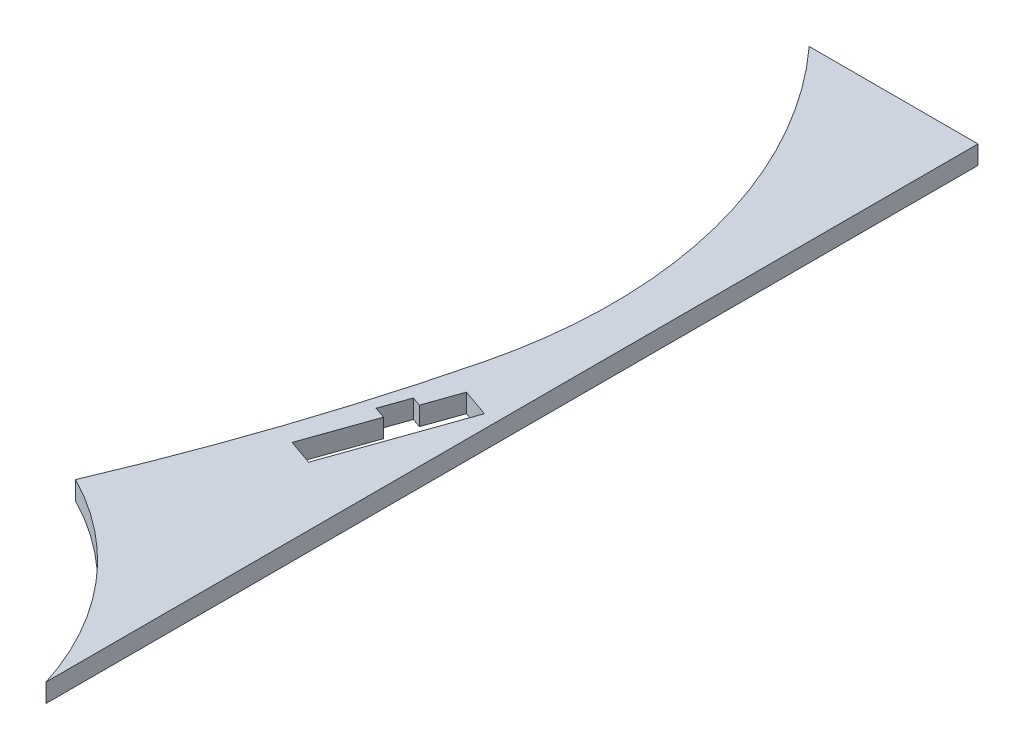
ISO-10303-21;
HEADER;
FILE_DESCRIPTION(('STEP AP214'),'2;1');
FILE_NAME('part.step','',(''),(''),'','','');
FILE_SCHEMA(('AUTOMOTIVE_DESIGN { 1 0 10303 214 1 1 1 1 }'));
ENDSEC;
DATA;
#1=APPLICATION_CONTEXT('core data for automotive mechanical design processes');
#2=APPLICATION_PROTOCOL_DEFINITION('international standard','automotive_design',2000,#1);
#3=PRODUCT_CONTEXT('',#1,'mechanical');
#4=PRODUCT('Part','Part','',(#3));
#5=PRODUCT_RELATED_PRODUCT_CATEGORY('part','',(#4));
#6=PRODUCT_DEFINITION_FORMATION('','',#4);
#7=PRODUCT_DEFINITION_CONTEXT('part definition',#1,'design');
#8=PRODUCT_DEFINITION('design','',#6,#7);
#9=PRODUCT_DEFINITION_SHAPE('','',#8);
#10=(LENGTH_UNIT() NAMED_UNIT(*) SI_UNIT(.MILLI.,.METRE.));
#11=(NAMED_UNIT(*) PLANE_ANGLE_UNIT() SI_UNIT($,.RADIAN.));
#12=(NAMED_UNIT(*) SI_UNIT($,.STERADIAN.) SOLID_ANGLE_UNIT());
#13=UNCERTAINTY_MEASURE_WITH_UNIT(LENGTH_MEASURE(1.E-05),#10,'distance_accuracy_value','');
#14=(GEOMETRIC_REPRESENTATION_CONTEXT(3) GLOBAL_UNCERTAINTY_ASSIGNED_CONTEXT((#13)) GLOBAL_UNIT_ASSIGNED_CONTEXT((#10,
#11,#12)) REPRESENTATION_CONTEXT('',''));
#15=CARTESIAN_POINT('',(0.,0.,0.));
#16=DIRECTION('',(0.,0.,1.));
#17=DIRECTION('',(1.,0.,0.));
#18=AXIS2_PLACEMENT_3D('',#15,#16,#17);
#19=CARTESIAN_POINT('',(-123.824999999997,6.35,32.9878065635989));
#20=DIRECTION('',(0.,-1.,0.));
#21=DIRECTION('',(0.,0.,-1.));
#22=AXIS2_PLACEMENT_3D('',#19,#20,#21);
#23=CYLINDRICAL_SURFACE('',#22,109.845327651549);
#24=CARTESIAN_POINT('',(-123.824999999997,0.,32.9878065635989));
#25=DIRECTION('',(0.,-1.,0.));
#26=DIRECTION('',(0.,0.,-1.));
#27=AXIS2_PLACEMENT_3D('',#24,#25,#26);
#28=CIRCLE('',#27,109.845327651549);
#29=CARTESIAN_POINT('',(-73.7224108953443,0.,-64.7655901645279));
#30=VERTEX_POINT('',#29);
#31=CARTESIAN_POINT('',(-19.0500000000028,0.,0.));
#32=VERTEX_POINT('',#31);
#33=EDGE_CURVE('E184',#30,#32,#28,.T.);
#34=ORIENTED_EDGE('',*,*,#33,.T.);
#35=DIRECTION('',(0.,-1.,0.));
#36=VECTOR('',#35,1.);
#37=CARTESIAN_POINT('',(-19.0500000000028,6.35,0.));
#38=LINE('',#37,#36);
#39=CARTESIAN_POINT('',(-19.0500000000028,6.35,0.));
#40=VERTEX_POINT('',#39);
#41=EDGE_CURVE('E11',#40,#32,#38,.T.);
#42=ORIENTED_EDGE('',*,*,#41,.F.);
#43=CARTESIAN_POINT('',(-123.824999999997,6.35,32.9878065635989));
#44=DIRECTION('',(0.,-1.,0.));
#45=DIRECTION('',(0.,0.,-1.));
#46=AXIS2_PLACEMENT_3D('',#43,#44,#45);
#47=CIRCLE('',#46,109.845327651549);
#48=CARTESIAN_POINT('',(-73.7224108953443,6.35,-64.7655901645279));
#49=VERTEX_POINT('',#48);
#50=EDGE_CURVE('E196',#49,#40,#47,.T.);
#51=ORIENTED_EDGE('',*,*,#50,.F.);
#52=DIRECTION('',(0.,-1.,0.));
#53=VECTOR('',#52,1.);
#54=CARTESIAN_POINT('',(-73.7224108953443,6.35,-64.7655901645279));
#55=LINE('',#54,#53);
#56=EDGE_CURVE('E208',#49,#30,#55,.T.);
#57=ORIENTED_EDGE('',*,*,#56,.T.);
#58=EDGE_LOOP('',(#34,#42,#51,#57));
#59=FACE_BOUND('',#58,.T.);
#60=ADVANCED_FACE('F33',(#59),#23,.F.);
#61=CARTESIAN_POINT('',(-19.0500000000028,6.35,-169.388632852006));
#62=DIRECTION('',(-1.,0.,0.));
#63=DIRECTION('',(0.,0.,1.));
#64=AXIS2_PLACEMENT_3D('',#61,#62,#63);
#65=PLANE('',#64);
#66=DIRECTION('',(0.,0.,-1.));
#67=VECTOR('',#66,1.);
#68=CARTESIAN_POINT('',(-19.0500000000028,0.,-169.388632852006));
#69=LINE('',#68,#67);
#70=CARTESIAN_POINT('',(-19.0500000000028,0.,-317.5));
#71=VERTEX_POINT('',#70);
#72=EDGE_CURVE('E211',#32,#71,#69,.T.);
#73=ORIENTED_EDGE('',*,*,#72,.T.);
#74=DIRECTION('',(0.,-1.,0.));
#75=VECTOR('',#74,1.);
#76=CARTESIAN_POINT('',(-19.0500000000028,6.35,-317.5));
#77=LINE('',#76,#75);
#78=CARTESIAN_POINT('',(-19.0500000000028,6.35,-317.5));
#79=VERTEX_POINT('',#78);
#80=EDGE_CURVE('E40',#79,#71,#77,.T.);
#81=ORIENTED_EDGE('',*,*,#80,.F.);
#82=DIRECTION('',(0.,0.,-1.));
#83=VECTOR('',#82,1.);
#84=CARTESIAN_POINT('',(-19.0500000000028,6.35,-169.388632852006));
#85=LINE('',#84,#83);
#86=EDGE_CURVE('E199',#40,#79,#85,.T.);
#87=ORIENTED_EDGE('',*,*,#86,.F.);
#88=ORIENTED_EDGE('',*,*,#41,.T.);
#89=EDGE_LOOP('',(#73,#81,#87,#88));
#90=FACE_BOUND('',#89,.T.);
#91=ADVANCED_FACE('F248',(#90),#65,.F.);
#92=CARTESIAN_POINT('',(-19.0500000000028,6.35,-317.5));
#93=DIRECTION('',(0.,0.,1.));
#94=DIRECTION('',(1.,0.,0.));
#95=AXIS2_PLACEMENT_3D('',#92,#93,#94);
#96=PLANE('',#95);
#97=DIRECTION('',(-1.,0.,0.));
#98=VECTOR('',#97,1.);
#99=CARTESIAN_POINT('',(-19.0500000000028,0.,-317.5));
#100=LINE('',#99,#98);
#101=CARTESIAN_POINT('',(-76.5547912673362,0.,-317.499999999998));
#102=VERTEX_POINT('',#101);
#103=EDGE_CURVE('E213',#71,#102,#100,.T.);
#104=ORIENTED_EDGE('',*,*,#103,.T.);
#105=DIRECTION('',(0.,-1.,0.));
#106=VECTOR('',#105,1.);
#107=CARTESIAN_POINT('',(-76.5547912673362,6.35,-317.499999999998));
#108=LINE('',#107,#106);
#109=CARTESIAN_POINT('',(-76.5547912673362,6.35,-317.499999999998));
#110=VERTEX_POINT('',#109);
#111=EDGE_CURVE('E223',#110,#102,#108,.T.);
#112=ORIENTED_EDGE('',*,*,#111,.F.);
#113=DIRECTION('',(-1.,0.,0.));
#114=VECTOR('',#113,1.);
#115=CARTESIAN_POINT('',(-19.0500000000028,6.35,-317.5));
#116=LINE('',#115,#114);
#117=EDGE_CURVE('E202',#79,#110,#116,.T.);
#118=ORIENTED_EDGE('',*,*,#117,.F.);
#119=ORIENTED_EDGE('',*,*,#80,.T.);
#120=EDGE_LOOP('',(#104,#112,#118,#119));
#121=FACE_BOUND('',#120,.T.);
#122=ADVANCED_FACE('F230',(#121),#96,.F.);
#123=CARTESIAN_POINT('',(-196.510004657738,6.35,-208.136195969553));
#124=DIRECTION('',(0.,-1.,0.));
#125=DIRECTION('',(0.,0.,-1.));
#126=AXIS2_PLACEMENT_3D('',#123,#124,#125);
#127=CYLINDRICAL_SURFACE('',#126,162.325890884808);
#128=CARTESIAN_POINT('',(-196.510004657738,0.,-208.136195969553));
#129=DIRECTION('',(0.,-1.,0.));
#130=DIRECTION('',(0.,0.,1.));
#131=AXIS2_PLACEMENT_3D('',#128,#129,#130);
#132=CIRCLE('',#131,162.325890884808);
#133=CARTESIAN_POINT('',(-38.8765018609086,0.,-169.388632852004));
#134=VERTEX_POINT('',#133);
#135=EDGE_CURVE('E215',#102,#134,#132,.T.);
#136=ORIENTED_EDGE('',*,*,#135,.T.);
#137=DIRECTION('',(0.,-1.,0.));
#138=VECTOR('',#137,1.);
#139=CARTESIAN_POINT('',(-38.8765018609086,6.35,-169.388632852004));
#140=LINE('',#139,#138);
#141=CARTESIAN_POINT('',(-38.8765018609086,6.35,-169.388632852004));
#142=VERTEX_POINT('',#141);
#143=EDGE_CURVE('E220',#142,#134,#140,.T.);
#144=ORIENTED_EDGE('',*,*,#143,.F.);
#145=CARTESIAN_POINT('',(-196.510004657738,6.35,-208.136195969553));
#146=DIRECTION('',(0.,-1.,0.));
#147=DIRECTION('',(0.,0.,1.));
#148=AXIS2_PLACEMENT_3D('',#145,#146,#147);
#149=CIRCLE('',#148,162.325890884808);
#150=EDGE_CURVE('E204',#110,#142,#149,.T.);
#151=ORIENTED_EDGE('',*,*,#150,.F.);
#152=ORIENTED_EDGE('',*,*,#111,.T.);
#153=EDGE_LOOP('',(#136,#144,#151,#152));
#154=FACE_BOUND('',#153,.T.);
#155=ADVANCED_FACE('F238',(#154),#127,.F.);
#156=CARTESIAN_POINT('',(-704.917093121844,6.35,-333.106683842696));
#157=DIRECTION('',(0.,-1.,0.));
#158=DIRECTION('',(0.,0.,-1.));
#159=AXIS2_PLACEMENT_3D('',#156,#157,#158);
#160=CYLINDRICAL_SURFACE('',#159,685.867093121843);
#161=CARTESIAN_POINT('',(-704.917093121844,0.,-333.106683842696));
#162=DIRECTION('',(0.,-1.,0.));
#163=DIRECTION('',(0.,0.,1.));
#164=AXIS2_PLACEMENT_3D('',#161,#162,#163);
#165=CIRCLE('',#164,685.867093121843);
#166=EDGE_CURVE('E200',#134,#30,#165,.T.);
#167=ORIENTED_EDGE('',*,*,#166,.T.);
#168=ORIENTED_EDGE('',*,*,#56,.F.);
#169=CARTESIAN_POINT('',(-704.917093121844,6.35,-333.106683842696));
#170=DIRECTION('',(0.,-1.,0.));
#171=DIRECTION('',(0.,0.,1.));
#172=AXIS2_PLACEMENT_3D('',#169,#170,#171);
#173=CIRCLE('',#172,685.867093121843);
#174=EDGE_CURVE('E206',#142,#49,#173,.T.);
#175=ORIENTED_EDGE('',*,*,#174,.F.);
#176=ORIENTED_EDGE('',*,*,#143,.T.);
#177=EDGE_LOOP('',(#167,#168,#175,#176));
#178=FACE_BOUND('',#177,.T.);
#179=ADVANCED_FACE('F242',(#178),#160,.F.);
#180=CARTESIAN_POINT('',(-123.824999999997,6.35,32.9878065635989));
#181=DIRECTION('',(0.,-1.,0.));
#182=DIRECTION('',(0.,0.,-1.));
#183=AXIS2_PLACEMENT_3D('',#180,#181,#182);
#184=PLANE('',#183);
#185=DIRECTION('',(-0.332782108184797,0.,0.943003747856859));
#186=VECTOR('',#185,1.);
#187=CARTESIAN_POINT('',(-40.2708944301103,6.35,-146.382292029944));
#188=LINE('',#187,#186);
#189=CARTESIAN_POINT('',(-40.2708944301103,6.35,-146.382292029944));
#190=VERTEX_POINT('',#189);
#191=CARTESIAN_POINT('',(-43.5885656576584,6.35,-136.981016165685));
#192=VERTEX_POINT('',#191);
#193=EDGE_CURVE('E166',#190,#192,#188,.T.);
#194=ORIENTED_EDGE('',*,*,#193,.F.);
#195=DIRECTION('',(-0.943003747856859,0.,-0.332782108184795));
#196=VECTOR('',#195,1.);
#197=CARTESIAN_POINT('',(-37.1331437594913,6.35,-145.27499284317));
#198=LINE('',#197,#196);
#199=CARTESIAN_POINT('',(-37.1331437594913,6.35,-145.27499284317));
#200=VERTEX_POINT('',#199);
#201=EDGE_CURVE('E47',#200,#190,#198,.T.);
#202=ORIENTED_EDGE('',*,*,#201,.F.);
#203=DIRECTION('',(-0.332782108184796,0.,0.943003747856859));
#204=VECTOR('',#203,1.);
#205=CARTESIAN_POINT('',(-32.9448479805099,6.35,-157.143355112572));
#206=LINE('',#205,#204);
#207=CARTESIAN_POINT('',(-32.9448479805099,6.35,-157.143355112572));
#208=VERTEX_POINT('',#207);
#209=EDGE_CURVE('E146',#208,#200,#206,.T.);
#210=ORIENTED_EDGE('',*,*,#209,.F.);
#211=DIRECTION('',(-0.943003747856859,0.,-0.332782108184796));
#212=VECTOR('',#211,1.);
#213=CARTESIAN_POINT('',(-23.5435721162512,6.35,-153.825683885023));
#214=LINE('',#213,#212);
#215=CARTESIAN_POINT('',(-23.5435721162512,6.35,-153.825683885023));
#216=VERTEX_POINT('',#215);
#217=EDGE_CURVE('E149',#216,#208,#214,.T.);
#218=ORIENTED_EDGE('',*,*,#217,.F.);
#219=DIRECTION('',(0.332782108184796,0.,-0.943003747856859));
#220=VECTOR('',#219,1.);
#221=CARTESIAN_POINT('',(-39.164098048759,6.35,-109.561842363621));
#222=LINE('',#221,#220);
#223=CARTESIAN_POINT('',(-39.164098048759,6.35,-109.561842363621));
#224=VERTEX_POINT('',#223);
#225=EDGE_CURVE('E177',#224,#216,#222,.T.);
#226=ORIENTED_EDGE('',*,*,#225,.F.);
#227=DIRECTION('',(0.943003747856859,0.,0.332782108184796));
#228=VECTOR('',#227,1.);
#229=CARTESIAN_POINT('',(-47.8108766143577,6.35,-112.61325462641));
#230=LINE('',#229,#228);
#231=CARTESIAN_POINT('',(-47.8108766143577,6.35,-112.61325462641));
#232=VERTEX_POINT('',#231);
#233=EDGE_CURVE('E174',#232,#224,#230,.T.);
#234=ORIENTED_EDGE('',*,*,#233,.F.);
#235=DIRECTION('',(-0.332782108184796,0.,0.943003747856859));
#236=VECTOR('',#235,1.);
#237=CARTESIAN_POINT('',(-39.6963176883795,6.35,-135.607458014153));
#238=LINE('',#237,#236);
#239=CARTESIAN_POINT('',(-39.6963176883795,6.35,-135.607458014153));
#240=VERTEX_POINT('',#239);
#241=EDGE_CURVE('E171',#240,#232,#238,.T.);
#242=ORIENTED_EDGE('',*,*,#241,.F.);
#243=DIRECTION('',(0.943003747856859,0.,0.332782108184797));
#244=VECTOR('',#243,1.);
#245=CARTESIAN_POINT('',(-43.5885656576584,6.35,-136.981016165685));
#246=LINE('',#245,#244);
#247=EDGE_CURVE('E168',#192,#240,#246,.T.);
#248=ORIENTED_EDGE('',*,*,#247,.F.);
#249=EDGE_LOOP('',(#194,#202,#210,#218,#226,#234,#242,#248));
#250=FACE_BOUND('',#249,.T.);
#251=ORIENTED_EDGE('',*,*,#50,.T.);
#252=ORIENTED_EDGE('',*,*,#86,.T.);
#253=ORIENTED_EDGE('',*,*,#117,.T.);
#254=ORIENTED_EDGE('',*,*,#150,.T.);
#255=ORIENTED_EDGE('',*,*,#174,.T.);
#256=EDGE_LOOP('',(#251,#252,#253,#254,#255));
#257=FACE_BOUND('',#256,.T.);
#258=ADVANCED_FACE('F246',(#250,#257),#184,.F.);
#259=CARTESIAN_POINT('',(-123.824999999997,0.,32.9878065635989));
#260=DIRECTION('',(0.,-1.,0.));
#261=DIRECTION('',(0.,0.,-1.));
#262=AXIS2_PLACEMENT_3D('',#259,#260,#261);
#263=PLANE('',#262);
#264=DIRECTION('',(-0.943003747856859,0.,-0.332782108184795));
#265=VECTOR('',#264,1.);
#266=CARTESIAN_POINT('',(-37.1331437594913,0.,-145.27499284317));
#267=LINE('',#266,#265);
#268=CARTESIAN_POINT('',(-37.1331437594913,0.,-145.27499284317));
#269=VERTEX_POINT('',#268);
#270=CARTESIAN_POINT('',(-40.2708944301103,0.,-146.382292029944));
#271=VERTEX_POINT('',#270);
#272=EDGE_CURVE('E129',#269,#271,#267,.T.);
#273=ORIENTED_EDGE('',*,*,#272,.T.);
#274=DIRECTION('',(-0.332782108184797,0.,0.943003747856859));
#275=VECTOR('',#274,1.);
#276=CARTESIAN_POINT('',(-40.2708944301103,0.,-146.382292029944));
#277=LINE('',#276,#275);
#278=CARTESIAN_POINT('',(-43.5885656576584,0.,-136.981016165685));
#279=VERTEX_POINT('',#278);
#280=EDGE_CURVE('E138',#271,#279,#277,.T.);
#281=ORIENTED_EDGE('',*,*,#280,.T.);
#282=DIRECTION('',(0.943003747856859,0.,0.332782108184797));
#283=VECTOR('',#282,1.);
#284=CARTESIAN_POINT('',(-43.5885656576584,0.,-136.981016165685));
#285=LINE('',#284,#283);
#286=CARTESIAN_POINT('',(-39.6963176883795,0.,-135.607458014153));
#287=VERTEX_POINT('',#286);
#288=EDGE_CURVE('E55',#279,#287,#285,.T.);
#289=ORIENTED_EDGE('',*,*,#288,.T.);
#290=DIRECTION('',(-0.332782108184796,0.,0.943003747856859));
#291=VECTOR('',#290,1.);
#292=CARTESIAN_POINT('',(-39.6963176883795,0.,-135.607458014153));
#293=LINE('',#292,#291);
#294=CARTESIAN_POINT('',(-47.8108766143577,0.,-112.61325462641));
#295=VERTEX_POINT('',#294);
#296=EDGE_CURVE('E153',#287,#295,#293,.T.);
#297=ORIENTED_EDGE('',*,*,#296,.T.);
#298=DIRECTION('',(0.943003747856859,0.,0.332782108184796));
#299=VECTOR('',#298,1.);
#300=CARTESIAN_POINT('',(-47.8108766143577,0.,-112.61325462641));
#301=LINE('',#300,#299);
#302=CARTESIAN_POINT('',(-39.164098048759,0.,-109.561842363621));
#303=VERTEX_POINT('',#302);
#304=EDGE_CURVE('E156',#295,#303,#301,.T.);
#305=ORIENTED_EDGE('',*,*,#304,.T.);
#306=DIRECTION('',(0.332782108184796,0.,-0.943003747856859));
#307=VECTOR('',#306,1.);
#308=CARTESIAN_POINT('',(-39.164098048759,0.,-109.561842363621));
#309=LINE('',#308,#307);
#310=CARTESIAN_POINT('',(-23.5435721162512,0.,-153.825683885023));
#311=VERTEX_POINT('',#310);
#312=EDGE_CURVE('E159',#303,#311,#309,.T.);
#313=ORIENTED_EDGE('',*,*,#312,.T.);
#314=DIRECTION('',(-0.943003747856859,0.,-0.332782108184796));
#315=VECTOR('',#314,1.);
#316=CARTESIAN_POINT('',(-23.5435721162512,0.,-153.825683885023));
#317=LINE('',#316,#315);
#318=CARTESIAN_POINT('',(-32.9448479805099,0.,-157.143355112572));
#319=VERTEX_POINT('',#318);
#320=EDGE_CURVE('E162',#311,#319,#317,.T.);
#321=ORIENTED_EDGE('',*,*,#320,.T.);
#322=DIRECTION('',(-0.332782108184796,0.,0.943003747856859));
#323=VECTOR('',#322,1.);
#324=CARTESIAN_POINT('',(-32.9448479805099,0.,-157.143355112572));
#325=LINE('',#324,#323);
#326=EDGE_CURVE('E135',#319,#269,#325,.T.);
#327=ORIENTED_EDGE('',*,*,#326,.T.);
#328=EDGE_LOOP('',(#273,#281,#289,#297,#305,#313,#321,#327));
#329=FACE_BOUND('',#328,.T.);
#330=ORIENTED_EDGE('',*,*,#72,.F.);
#331=ORIENTED_EDGE('',*,*,#33,.F.);
#332=ORIENTED_EDGE('',*,*,#166,.F.);
#333=ORIENTED_EDGE('',*,*,#135,.F.);
#334=ORIENTED_EDGE('',*,*,#103,.F.);
#335=EDGE_LOOP('',(#330,#331,#332,#333,#334));
#336=FACE_BOUND('',#335,.T.);
#337=ADVANCED_FACE('F142',(#329,#336),#263,.T.);
#338=CARTESIAN_POINT('',(-37.1331437594913,0.,-145.27499284317));
#339=DIRECTION('',(0.332782108184795,0.,-0.943003747856859));
#340=DIRECTION('',(-0.943003747856859,0.,-0.332782108184795));
#341=AXIS2_PLACEMENT_3D('',#338,#339,#340);
#342=PLANE('',#341);
#343=ORIENTED_EDGE('',*,*,#201,.T.);
#344=DIRECTION('',(0.,1.,0.));
#345=VECTOR('',#344,1.);
#346=CARTESIAN_POINT('',(-40.2708944301103,0.,-146.382292029944));
#347=LINE('',#346,#345);
#348=EDGE_CURVE('E125',#271,#190,#347,.T.);
#349=ORIENTED_EDGE('',*,*,#348,.F.);
#350=ORIENTED_EDGE('',*,*,#272,.F.);
#351=DIRECTION('',(0.,1.,0.));
#352=VECTOR('',#351,1.);
#353=CARTESIAN_POINT('',(-37.1331437594913,0.,-145.27499284317));
#354=LINE('',#353,#352);
#355=EDGE_CURVE('E182',#269,#200,#354,.T.);
#356=ORIENTED_EDGE('',*,*,#355,.T.);
#357=EDGE_LOOP('',(#343,#349,#350,#356));
#358=FACE_BOUND('',#357,.T.);
#359=ADVANCED_FACE('F127',(#358),#342,.F.);
#360=CARTESIAN_POINT('',(-32.9448479805099,0.,-157.143355112572));
#361=DIRECTION('',(-0.943003747856859,0.,-0.332782108184796));
#362=DIRECTION('',(-0.332782108184796,0.,0.943003747856859));
#363=AXIS2_PLACEMENT_3D('',#360,#361,#362);
#364=PLANE('',#363);
#365=ORIENTED_EDGE('',*,*,#209,.T.);
#366=ORIENTED_EDGE('',*,*,#355,.F.);
#367=ORIENTED_EDGE('',*,*,#326,.F.);
#368=DIRECTION('',(0.,1.,0.));
#369=VECTOR('',#368,1.);
#370=CARTESIAN_POINT('',(-32.9448479805099,0.,-157.143355112572));
#371=LINE('',#370,#369);
#372=EDGE_CURVE('E185',#319,#208,#371,.T.);
#373=ORIENTED_EDGE('',*,*,#372,.T.);
#374=EDGE_LOOP('',(#365,#366,#367,#373));
#375=FACE_BOUND('',#374,.T.);
#376=ADVANCED_FACE('F270',(#375),#364,.F.);
#377=CARTESIAN_POINT('',(-23.5435721162512,0.,-153.825683885023));
#378=DIRECTION('',(0.332782108184796,0.,-0.943003747856859));
#379=DIRECTION('',(-0.943003747856859,0.,-0.332782108184796));
#380=AXIS2_PLACEMENT_3D('',#377,#378,#379);
#381=PLANE('',#380);
#382=ORIENTED_EDGE('',*,*,#217,.T.);
#383=ORIENTED_EDGE('',*,*,#372,.F.);
#384=ORIENTED_EDGE('',*,*,#320,.F.);
#385=DIRECTION('',(0.,1.,0.));
#386=VECTOR('',#385,1.);
#387=CARTESIAN_POINT('',(-23.5435721162512,0.,-153.825683885023));
#388=LINE('',#387,#386);
#389=EDGE_CURVE('E187',#311,#216,#388,.T.);
#390=ORIENTED_EDGE('',*,*,#389,.T.);
#391=EDGE_LOOP('',(#382,#383,#384,#390));
#392=FACE_BOUND('',#391,.T.);
#393=ADVANCED_FACE('F287',(#392),#381,.F.);
#394=CARTESIAN_POINT('',(-39.164098048759,0.,-109.561842363621));
#395=DIRECTION('',(0.943003747856859,0.,0.332782108184796));
#396=DIRECTION('',(0.332782108184796,0.,-0.943003747856859));
#397=AXIS2_PLACEMENT_3D('',#394,#395,#396);
#398=PLANE('',#397);
#399=ORIENTED_EDGE('',*,*,#225,.T.);
#400=ORIENTED_EDGE('',*,*,#389,.F.);
#401=ORIENTED_EDGE('',*,*,#312,.F.);
#402=DIRECTION('',(0.,1.,0.));
#403=VECTOR('',#402,1.);
#404=CARTESIAN_POINT('',(-39.164098048759,0.,-109.561842363621));
#405=LINE('',#404,#403);
#406=EDGE_CURVE('E189',#303,#224,#405,.T.);
#407=ORIENTED_EDGE('',*,*,#406,.T.);
#408=EDGE_LOOP('',(#399,#400,#401,#407));
#409=FACE_BOUND('',#408,.T.);
#410=ADVANCED_FACE('F283',(#409),#398,.F.);
#411=CARTESIAN_POINT('',(-47.8108766143577,0.,-112.61325462641));
#412=DIRECTION('',(-0.332782108184796,0.,0.943003747856859));
#413=DIRECTION('',(0.943003747856859,0.,0.332782108184796));
#414=AXIS2_PLACEMENT_3D('',#411,#412,#413);
#415=PLANE('',#414);
#416=ORIENTED_EDGE('',*,*,#233,.T.);
#417=ORIENTED_EDGE('',*,*,#406,.F.);
#418=ORIENTED_EDGE('',*,*,#304,.F.);
#419=DIRECTION('',(0.,1.,0.));
#420=VECTOR('',#419,1.);
#421=CARTESIAN_POINT('',(-47.8108766143577,0.,-112.61325462641));
#422=LINE('',#421,#420);
#423=EDGE_CURVE('E191',#295,#232,#422,.T.);
#424=ORIENTED_EDGE('',*,*,#423,.T.);
#425=EDGE_LOOP('',(#416,#417,#418,#424));
#426=FACE_BOUND('',#425,.T.);
#427=ADVANCED_FACE('F279',(#426),#415,.F.);
#428=CARTESIAN_POINT('',(-39.6963176883795,0.,-135.607458014153));
#429=DIRECTION('',(-0.943003747856859,0.,-0.332782108184796));
#430=DIRECTION('',(-0.332782108184796,0.,0.943003747856859));
#431=AXIS2_PLACEMENT_3D('',#428,#429,#430);
#432=PLANE('',#431);
#433=ORIENTED_EDGE('',*,*,#241,.T.);
#434=ORIENTED_EDGE('',*,*,#423,.F.);
#435=ORIENTED_EDGE('',*,*,#296,.F.);
#436=DIRECTION('',(0.,1.,0.));
#437=VECTOR('',#436,1.);
#438=CARTESIAN_POINT('',(-39.6963176883795,0.,-135.607458014153));
#439=LINE('',#438,#437);
#440=EDGE_CURVE('E193',#287,#240,#439,.T.);
#441=ORIENTED_EDGE('',*,*,#440,.T.);
#442=EDGE_LOOP('',(#433,#434,#435,#441));
#443=FACE_BOUND('',#442,.T.);
#444=ADVANCED_FACE('F276',(#443),#432,.F.);
#445=CARTESIAN_POINT('',(-43.5885656576584,0.,-136.981016165685));
#446=DIRECTION('',(-0.332782108184797,0.,0.943003747856859));
#447=DIRECTION('',(0.943003747856859,0.,0.332782108184797));
#448=AXIS2_PLACEMENT_3D('',#445,#446,#447);
#449=PLANE('',#448);
#450=ORIENTED_EDGE('',*,*,#247,.T.);
#451=ORIENTED_EDGE('',*,*,#440,.F.);
#452=ORIENTED_EDGE('',*,*,#288,.F.);
#453=DIRECTION('',(0.,1.,0.));
#454=VECTOR('',#453,1.);
#455=CARTESIAN_POINT('',(-43.5885656576584,0.,-136.981016165685));
#456=LINE('',#455,#454);
#457=EDGE_CURVE('E134',#279,#192,#456,.T.);
#458=ORIENTED_EDGE('',*,*,#457,.T.);
#459=EDGE_LOOP('',(#450,#451,#452,#458));
#460=FACE_BOUND('',#459,.T.);
#461=ADVANCED_FACE('F273',(#460),#449,.F.);
#462=CARTESIAN_POINT('',(-40.2708944301103,0.,-146.382292029944));
#463=DIRECTION('',(-0.943003747856859,0.,-0.332782108184797));
#464=DIRECTION('',(-0.332782108184797,0.,0.943003747856859));
#465=AXIS2_PLACEMENT_3D('',#462,#463,#464);
#466=PLANE('',#465);
#467=ORIENTED_EDGE('',*,*,#193,.T.);
#468=ORIENTED_EDGE('',*,*,#457,.F.);
#469=ORIENTED_EDGE('',*,*,#280,.F.);
#470=ORIENTED_EDGE('',*,*,#348,.T.);
#471=EDGE_LOOP('',(#467,#468,#469,#470));
#472=FACE_BOUND('',#471,.T.);
#473=ADVANCED_FACE('F139',(#472),#466,.F.);
#474=CLOSED_SHELL('',(#60,#91,#122,#155,#179,#258,#337,#359,#376,#393,#410,#427,#444,#461,#473));
#475=MANIFOLD_SOLID_BREP('B2',#474);
#476=ADVANCED_BREP_SHAPE_REPRESENTATION('',(#18,#475),#14);
#477=SHAPE_DEFINITION_REPRESENTATION(#9,#476);
ENDSEC;
END-ISO-10303-21;
